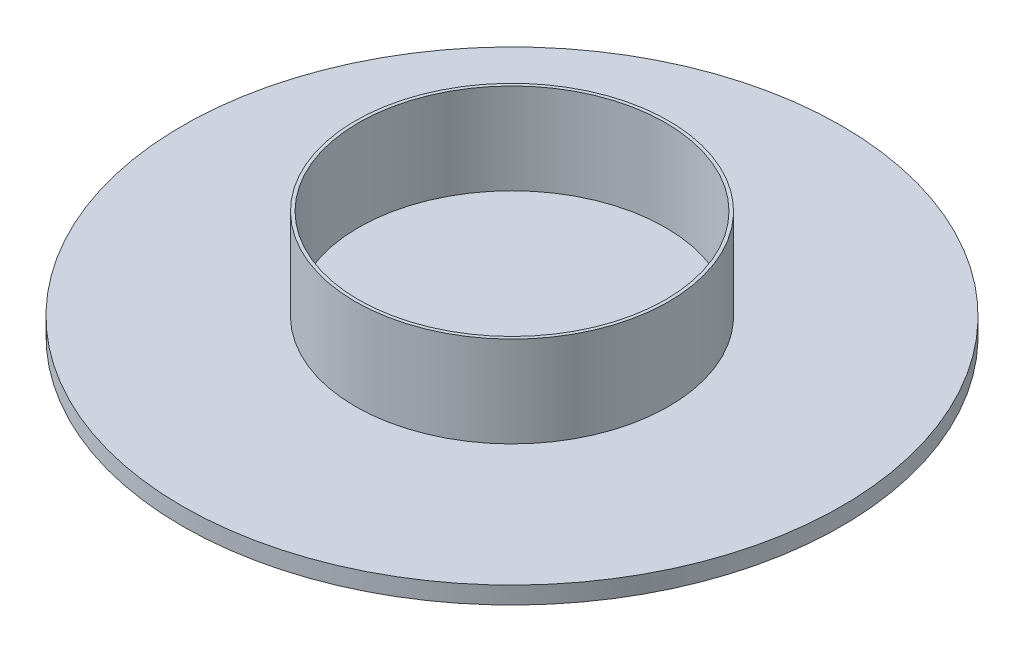
ISO-10303-21;
HEADER;
FILE_DESCRIPTION(('STEP AP214'),'2;1');
FILE_NAME('part.step','',(''),(''),'','','');
FILE_SCHEMA(('AUTOMOTIVE_DESIGN { 1 0 10303 214 1 1 1 1 }'));
ENDSEC;
DATA;
#1=APPLICATION_CONTEXT('core data for automotive mechanical design processes');
#2=APPLICATION_PROTOCOL_DEFINITION('international standard','automotive_design',2000,#1);
#3=PRODUCT_CONTEXT('',#1,'mechanical');
#4=PRODUCT('Part','Part','',(#3));
#5=PRODUCT_RELATED_PRODUCT_CATEGORY('part','',(#4));
#6=PRODUCT_DEFINITION_FORMATION('','',#4);
#7=PRODUCT_DEFINITION_CONTEXT('part definition',#1,'design');
#8=PRODUCT_DEFINITION('design','',#6,#7);
#9=PRODUCT_DEFINITION_SHAPE('','',#8);
#10=(LENGTH_UNIT() NAMED_UNIT(*) SI_UNIT(.MILLI.,.METRE.));
#11=(NAMED_UNIT(*) PLANE_ANGLE_UNIT() SI_UNIT($,.RADIAN.));
#12=(NAMED_UNIT(*) SI_UNIT($,.STERADIAN.) SOLID_ANGLE_UNIT());
#13=UNCERTAINTY_MEASURE_WITH_UNIT(LENGTH_MEASURE(1.E-05),#10,'distance_accuracy_value','');
#14=(GEOMETRIC_REPRESENTATION_CONTEXT(3) GLOBAL_UNCERTAINTY_ASSIGNED_CONTEXT((#13)) GLOBAL_UNIT_ASSIGNED_CONTEXT((#10,
#11,#12)) REPRESENTATION_CONTEXT('',''));
#15=CARTESIAN_POINT('',(0.,0.,0.));
#16=DIRECTION('',(0.,0.,1.));
#17=DIRECTION('',(1.,0.,0.));
#18=AXIS2_PLACEMENT_3D('',#15,#16,#17);
#19=CARTESIAN_POINT('',(0.,-0.8,0.));
#20=DIRECTION('',(0.,1.,0.));
#21=DIRECTION('',(0.,0.,1.));
#22=AXIS2_PLACEMENT_3D('',#19,#20,#21);
#23=CYLINDRICAL_SURFACE('',#22,17.7);
#24=CARTESIAN_POINT('',(0.,-0.8,0.));
#25=DIRECTION('',(0.,1.,0.));
#26=DIRECTION('',(0.,0.,1.));
#27=AXIS2_PLACEMENT_3D('',#24,#25,#26);
#28=CIRCLE('',#27,17.7);
#29=CARTESIAN_POINT('',(0.,-0.8,17.7));
#30=VERTEX_POINT('',#29);
#31=EDGE_CURVE('E11',#30,#30,#28,.T.);
#32=ORIENTED_EDGE('',*,*,#31,.T.);
#33=EDGE_LOOP('',(#32));
#34=FACE_BOUND('',#33,.T.);
#35=CARTESIAN_POINT('',(0.,0.,0.));
#36=DIRECTION('',(0.,1.,0.));
#37=DIRECTION('',(0.,0.,1.));
#38=AXIS2_PLACEMENT_3D('',#35,#36,#37);
#39=CIRCLE('',#38,17.7);
#40=CARTESIAN_POINT('',(0.,0.,17.7));
#41=VERTEX_POINT('',#40);
#42=EDGE_CURVE('E42',#41,#41,#39,.T.);
#43=ORIENTED_EDGE('',*,*,#42,.F.);
#44=EDGE_LOOP('',(#43));
#45=FACE_BOUND('',#44,.T.);
#46=ADVANCED_FACE('F39',(#34,#45),#23,.T.);
#47=CARTESIAN_POINT('',(0.,-0.8,0.));
#48=DIRECTION('',(0.,1.,0.));
#49=DIRECTION('',(0.,0.,1.));
#50=AXIS2_PLACEMENT_3D('',#47,#48,#49);
#51=PLANE('',#50);
#52=CARTESIAN_POINT('',(0.,-0.8,0.));
#53=DIRECTION('',(0.,1.,0.));
#54=DIRECTION('',(0.,0.,1.));
#55=AXIS2_PLACEMENT_3D('',#52,#53,#54);
#56=CIRCLE('',#55,14.2);
#57=CARTESIAN_POINT('',(0.,-0.8,14.2));
#58=VERTEX_POINT('',#57);
#59=EDGE_CURVE('E49',#58,#58,#56,.T.);
#60=ORIENTED_EDGE('',*,*,#59,.T.);
#61=EDGE_LOOP('',(#60));
#62=FACE_BOUND('',#61,.T.);
#63=ORIENTED_EDGE('',*,*,#31,.F.);
#64=EDGE_LOOP('',(#63));
#65=FACE_BOUND('',#64,.T.);
#66=ADVANCED_FACE('F57',(#62,#65),#51,.F.);
#67=CARTESIAN_POINT('',(0.,0.,0.));
#68=DIRECTION('',(0.,1.,0.));
#69=DIRECTION('',(0.,0.,1.));
#70=AXIS2_PLACEMENT_3D('',#67,#68,#69);
#71=PLANE('',#70);
#72=CARTESIAN_POINT('',(0.,0.,0.));
#73=DIRECTION('',(0.,1.,0.));
#74=DIRECTION('',(0.,0.,1.));
#75=AXIS2_PLACEMENT_3D('',#72,#73,#74);
#76=CIRCLE('',#75,14.2);
#77=CARTESIAN_POINT('',(0.,0.,14.2));
#78=VERTEX_POINT('',#77);
#79=EDGE_CURVE('E51',#78,#78,#76,.T.);
#80=ORIENTED_EDGE('',*,*,#79,.F.);
#81=EDGE_LOOP('',(#80));
#82=FACE_BOUND('',#81,.T.);
#83=ORIENTED_EDGE('',*,*,#42,.T.);
#84=EDGE_LOOP('',(#83));
#85=FACE_BOUND('',#84,.T.);
#86=ADVANCED_FACE('F63',(#82,#85),#71,.T.);
#87=CARTESIAN_POINT('',(0.,-0.8,0.));
#88=DIRECTION('',(0.,1.,0.));
#89=DIRECTION('',(0.,0.,1.));
#90=AXIS2_PLACEMENT_3D('',#87,#88,#89);
#91=CYLINDRICAL_SURFACE('',#90,14.2);
#92=ORIENTED_EDGE('',*,*,#59,.F.);
#93=EDGE_LOOP('',(#92));
#94=FACE_BOUND('',#93,.T.);
#95=ORIENTED_EDGE('',*,*,#79,.T.);
#96=EDGE_LOOP('',(#95));
#97=FACE_BOUND('',#96,.T.);
#98=ADVANCED_FACE('F60',(#94,#97),#91,.F.);
#99=CLOSED_SHELL('',(#46,#66,#86,#98));
#100=MANIFOLD_SOLID_BREP('B2',#99);
#101=CARTESIAN_POINT('',(0.,1.6,0.));
#102=DIRECTION('',(0.,-1.,0.));
#103=DIRECTION('',(0.,0.,-1.));
#104=AXIS2_PLACEMENT_3D('',#101,#102,#103);
#105=CYLINDRICAL_SURFACE('',#104,30.5);
#106=CARTESIAN_POINT('',(0.,1.6,0.));
#107=DIRECTION('',(0.,1.,0.));
#108=DIRECTION('',(0.,0.,1.));
#109=AXIS2_PLACEMENT_3D('',#106,#107,#108);
#110=CIRCLE('',#109,30.5);
#111=CARTESIAN_POINT('',(0.,1.6,30.5));
#112=VERTEX_POINT('',#111);
#113=EDGE_CURVE('E108',#112,#112,#110,.T.);
#114=ORIENTED_EDGE('',*,*,#113,.F.);
#115=EDGE_LOOP('',(#114));
#116=FACE_BOUND('',#115,.T.);
#117=CARTESIAN_POINT('',(0.,0.,0.));
#118=DIRECTION('',(0.,1.,0.));
#119=DIRECTION('',(0.,0.,1.));
#120=AXIS2_PLACEMENT_3D('',#117,#118,#119);
#121=CIRCLE('',#120,30.5);
#122=CARTESIAN_POINT('',(0.,0.,30.5));
#123=VERTEX_POINT('',#122);
#124=EDGE_CURVE('E104',#123,#123,#121,.T.);
#125=ORIENTED_EDGE('',*,*,#124,.T.);
#126=EDGE_LOOP('',(#125));
#127=FACE_BOUND('',#126,.T.);
#128=ADVANCED_FACE('F101',(#116,#127),#105,.T.);
#129=CARTESIAN_POINT('',(0.,1.6,0.));
#130=DIRECTION('',(0.,1.,0.));
#131=DIRECTION('',(0.,0.,1.));
#132=AXIS2_PLACEMENT_3D('',#129,#130,#131);
#133=PLANE('',#132);
#134=CARTESIAN_POINT('',(0.,1.6,0.));
#135=DIRECTION('',(0.,1.,0.));
#136=DIRECTION('',(0.,0.,1.));
#137=AXIS2_PLACEMENT_3D('',#134,#135,#136);
#138=CIRCLE('',#137,14.5);
#139=CARTESIAN_POINT('',(0.,1.6,14.5));
#140=VERTEX_POINT('',#139);
#141=EDGE_CURVE('E117',#140,#140,#138,.F.);
#142=ORIENTED_EDGE('',*,*,#141,.T.);
#143=EDGE_LOOP('',(#142));
#144=FACE_BOUND('',#143,.T.);
#145=ORIENTED_EDGE('',*,*,#113,.T.);
#146=EDGE_LOOP('',(#145));
#147=FACE_BOUND('',#146,.T.);
#148=ADVANCED_FACE('F142',(#144,#147),#133,.T.);
#149=CARTESIAN_POINT('',(0.,0.,0.));
#150=DIRECTION('',(0.,1.,0.));
#151=DIRECTION('',(0.,0.,1.));
#152=AXIS2_PLACEMENT_3D('',#149,#150,#151);
#153=PLANE('',#152);
#154=ORIENTED_EDGE('',*,*,#124,.F.);
#155=EDGE_LOOP('',(#154));
#156=FACE_BOUND('',#155,.T.);
#157=ADVANCED_FACE('F134',(#156),#153,.F.);
#158=CARTESIAN_POINT('',(0.,10.,0.));
#159=DIRECTION('',(0.,1.,0.));
#160=DIRECTION('',(0.,0.,1.));
#161=AXIS2_PLACEMENT_3D('',#158,#159,#160);
#162=PLANE('',#161);
#163=CARTESIAN_POINT('',(0.,10.,0.));
#164=DIRECTION('',(0.,1.,0.));
#165=DIRECTION('',(0.,0.,1.));
#166=AXIS2_PLACEMENT_3D('',#163,#164,#165);
#167=CIRCLE('',#166,14.5);
#168=CARTESIAN_POINT('',(0.,10.,14.5));
#169=VERTEX_POINT('',#168);
#170=EDGE_CURVE('E115',#169,#169,#167,.T.);
#171=ORIENTED_EDGE('',*,*,#170,.T.);
#172=EDGE_LOOP('',(#171));
#173=FACE_BOUND('',#172,.T.);
#174=CARTESIAN_POINT('',(0.,10.,0.));
#175=DIRECTION('',(0.,1.,0.));
#176=DIRECTION('',(0.,0.,1.));
#177=AXIS2_PLACEMENT_3D('',#174,#175,#176);
#178=CIRCLE('',#177,14.2);
#179=CARTESIAN_POINT('',(0.,10.,14.2));
#180=VERTEX_POINT('',#179);
#181=EDGE_CURVE('E123',#180,#180,#178,.T.);
#182=ORIENTED_EDGE('',*,*,#181,.F.);
#183=EDGE_LOOP('',(#182));
#184=FACE_BOUND('',#183,.T.);
#185=ADVANCED_FACE('F131',(#173,#184),#162,.T.);
#186=CARTESIAN_POINT('',(0.,10.,0.));
#187=DIRECTION('',(0.,-1.,0.));
#188=DIRECTION('',(0.,0.,-1.));
#189=AXIS2_PLACEMENT_3D('',#186,#187,#188);
#190=CYLINDRICAL_SURFACE('',#189,14.5);
#191=ORIENTED_EDGE('',*,*,#141,.F.);
#192=EDGE_LOOP('',(#191));
#193=FACE_BOUND('',#192,.T.);
#194=ORIENTED_EDGE('',*,*,#170,.F.);
#195=EDGE_LOOP('',(#194));
#196=FACE_BOUND('',#195,.T.);
#197=ADVANCED_FACE('F133',(#193,#196),#190,.T.);
#198=CARTESIAN_POINT('',(0.,10.,0.));
#199=DIRECTION('',(0.,-1.,0.));
#200=DIRECTION('',(0.,0.,-1.));
#201=AXIS2_PLACEMENT_3D('',#198,#199,#200);
#202=CYLINDRICAL_SURFACE('',#201,14.2);
#203=CARTESIAN_POINT('',(0.,1.6,0.));
#204=DIRECTION('',(0.,1.,0.));
#205=DIRECTION('',(0.,0.,1.));
#206=AXIS2_PLACEMENT_3D('',#203,#204,#205);
#207=CIRCLE('',#206,14.2);
#208=CARTESIAN_POINT('',(0.,1.6,14.2));
#209=VERTEX_POINT('',#208);
#210=EDGE_CURVE('E38',#209,#209,#207,.F.);
#211=ORIENTED_EDGE('',*,*,#210,.T.);
#212=EDGE_LOOP('',(#211));
#213=FACE_BOUND('',#212,.T.);
#214=ORIENTED_EDGE('',*,*,#181,.T.);
#215=EDGE_LOOP('',(#214));
#216=FACE_BOUND('',#215,.T.);
#217=ADVANCED_FACE('F129',(#213,#216),#202,.F.);
#218=ORIENTED_EDGE('',*,*,#210,.F.);
#219=EDGE_LOOP('',(#218));
#220=FACE_BOUND('',#219,.T.);
#221=ADVANCED_FACE('F151',(#220),#133,.T.);
#222=CLOSED_SHELL('',(#128,#148,#157,#185,#197,#217,#221));
#223=MANIFOLD_SOLID_BREP('B6',#222);
#224=ADVANCED_BREP_SHAPE_REPRESENTATION('',(#18,#100,#223),#14);
#225=SHAPE_DEFINITION_REPRESENTATION(#9,#224);
ENDSEC;
END-ISO-10303-21;
